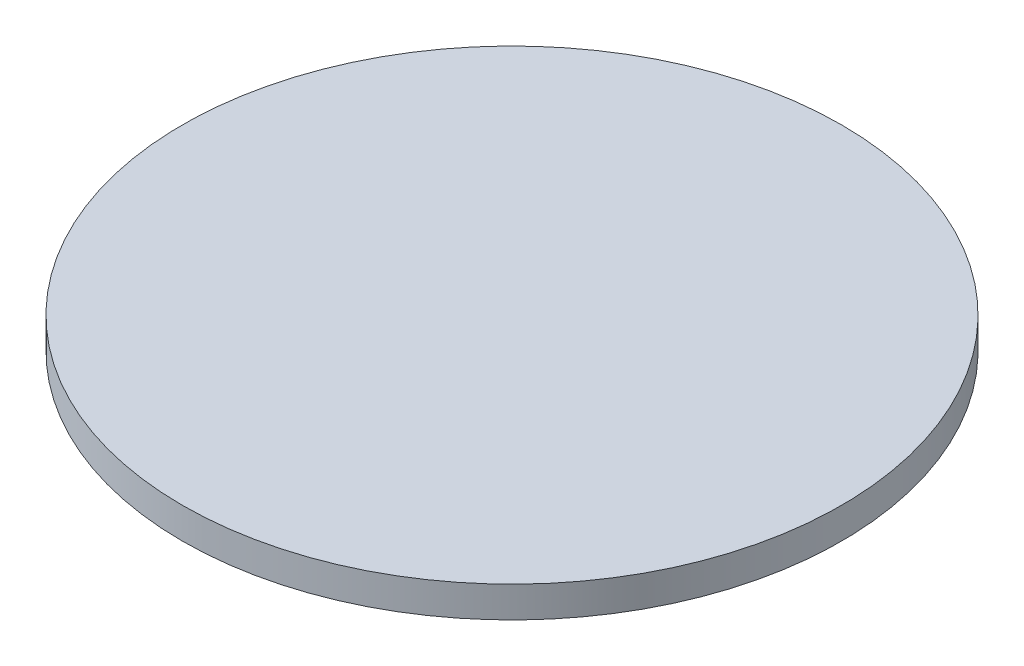
ISO-10303-21;
HEADER;
FILE_DESCRIPTION(('STEP AP214'),'2;1');
FILE_NAME('part.step','',(''),(''),'','','');
FILE_SCHEMA(('AUTOMOTIVE_DESIGN { 1 0 10303 214 1 1 1 1 }'));
ENDSEC;
DATA;
#1=APPLICATION_CONTEXT('core data for automotive mechanical design processes');
#2=APPLICATION_PROTOCOL_DEFINITION('international standard','automotive_design',2000,#1);
#3=PRODUCT_CONTEXT('',#1,'mechanical');
#4=PRODUCT('Part','Part','',(#3));
#5=PRODUCT_RELATED_PRODUCT_CATEGORY('part','',(#4));
#6=PRODUCT_DEFINITION_FORMATION('','',#4);
#7=PRODUCT_DEFINITION_CONTEXT('part definition',#1,'design');
#8=PRODUCT_DEFINITION('design','',#6,#7);
#9=PRODUCT_DEFINITION_SHAPE('','',#8);
#10=(LENGTH_UNIT() NAMED_UNIT(*) SI_UNIT(.MILLI.,.METRE.));
#11=(NAMED_UNIT(*) PLANE_ANGLE_UNIT() SI_UNIT($,.RADIAN.));
#12=(NAMED_UNIT(*) SI_UNIT($,.STERADIAN.) SOLID_ANGLE_UNIT());
#13=UNCERTAINTY_MEASURE_WITH_UNIT(LENGTH_MEASURE(1.E-05),#10,'distance_accuracy_value','');
#14=(GEOMETRIC_REPRESENTATION_CONTEXT(3) GLOBAL_UNCERTAINTY_ASSIGNED_CONTEXT((#13)) GLOBAL_UNIT_ASSIGNED_CONTEXT((#10,
#11,#12)) REPRESENTATION_CONTEXT('',''));
#15=CARTESIAN_POINT('',(0.,0.,0.));
#16=DIRECTION('',(0.,0.,1.));
#17=DIRECTION('',(1.,0.,0.));
#18=AXIS2_PLACEMENT_3D('',#15,#16,#17);
#19=CARTESIAN_POINT('',(0.,4.,0.));
#20=DIRECTION('',(0.,-1.,0.));
#21=DIRECTION('',(0.,0.,-1.));
#22=AXIS2_PLACEMENT_3D('',#19,#20,#21);
#23=CYLINDRICAL_SURFACE('',#22,42.5);
#24=CARTESIAN_POINT('',(0.,4.,0.));
#25=DIRECTION('',(0.,1.,0.));
#26=DIRECTION('',(0.,0.,1.));
#27=AXIS2_PLACEMENT_3D('',#24,#25,#26);
#28=CIRCLE('',#27,42.5);
#29=CARTESIAN_POINT('',(0.,4.,42.5));
#30=VERTEX_POINT('',#29);
#31=EDGE_CURVE('E10',#30,#30,#28,.T.);
#32=ORIENTED_EDGE('',*,*,#31,.F.);
#33=EDGE_LOOP('',(#32));
#34=FACE_BOUND('',#33,.T.);
#35=CARTESIAN_POINT('',(0.,0.,0.));
#36=DIRECTION('',(0.,1.,0.));
#37=DIRECTION('',(0.,0.,1.));
#38=AXIS2_PLACEMENT_3D('',#35,#36,#37);
#39=CIRCLE('',#38,42.5);
#40=CARTESIAN_POINT('',(0.,0.,42.5));
#41=VERTEX_POINT('',#40);
#42=EDGE_CURVE('E37',#41,#41,#39,.T.);
#43=ORIENTED_EDGE('',*,*,#42,.T.);
#44=EDGE_LOOP('',(#43));
#45=FACE_BOUND('',#44,.T.);
#46=ADVANCED_FACE('F34',(#34,#45),#23,.T.);
#47=CARTESIAN_POINT('',(0.,4.,0.));
#48=DIRECTION('',(0.,1.,0.));
#49=DIRECTION('',(0.,0.,1.));
#50=AXIS2_PLACEMENT_3D('',#47,#48,#49);
#51=PLANE('',#50);
#52=ORIENTED_EDGE('',*,*,#31,.T.);
#53=EDGE_LOOP('',(#52));
#54=FACE_BOUND('',#53,.T.);
#55=ADVANCED_FACE('F49',(#54),#51,.T.);
#56=CARTESIAN_POINT('',(0.,0.,0.));
#57=DIRECTION('',(0.,1.,0.));
#58=DIRECTION('',(0.,0.,1.));
#59=AXIS2_PLACEMENT_3D('',#56,#57,#58);
#60=PLANE('',#59);
#61=ORIENTED_EDGE('',*,*,#42,.F.);
#62=EDGE_LOOP('',(#61));
#63=FACE_BOUND('',#62,.T.);
#64=ADVANCED_FACE('F47',(#63),#60,.F.);
#65=CLOSED_SHELL('',(#46,#55,#64));
#66=MANIFOLD_SOLID_BREP('B2',#65);
#67=ADVANCED_BREP_SHAPE_REPRESENTATION('',(#18,#66),#14);
#68=SHAPE_DEFINITION_REPRESENTATION(#9,#67);
ENDSEC;
END-ISO-10303-21;
